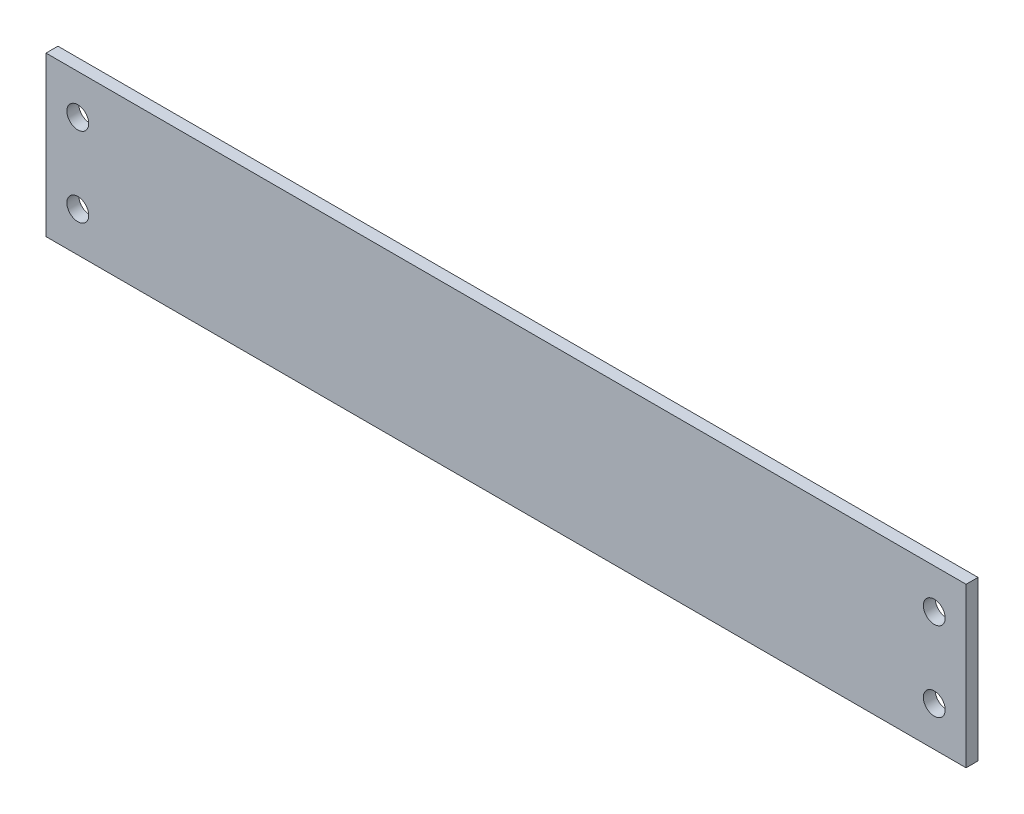
ISO-10303-21;
HEADER;
FILE_DESCRIPTION(('STEP AP214'),'2;1');
FILE_NAME('part.step','',(''),(''),'','','');
FILE_SCHEMA(('AUTOMOTIVE_DESIGN { 1 0 10303 214 1 1 1 1 }'));
ENDSEC;
DATA;
#1=APPLICATION_CONTEXT('core data for automotive mechanical design processes');
#2=APPLICATION_PROTOCOL_DEFINITION('international standard','automotive_design',2000,#1);
#3=PRODUCT_CONTEXT('',#1,'mechanical');
#4=PRODUCT('Part','Part','',(#3));
#5=PRODUCT_RELATED_PRODUCT_CATEGORY('part','',(#4));
#6=PRODUCT_DEFINITION_FORMATION('','',#4);
#7=PRODUCT_DEFINITION_CONTEXT('part definition',#1,'design');
#8=PRODUCT_DEFINITION('design','',#6,#7);
#9=PRODUCT_DEFINITION_SHAPE('','',#8);
#10=(LENGTH_UNIT() NAMED_UNIT(*) SI_UNIT(.MILLI.,.METRE.));
#11=(NAMED_UNIT(*) PLANE_ANGLE_UNIT() SI_UNIT($,.RADIAN.));
#12=(NAMED_UNIT(*) SI_UNIT($,.STERADIAN.) SOLID_ANGLE_UNIT());
#13=UNCERTAINTY_MEASURE_WITH_UNIT(LENGTH_MEASURE(1.E-05),#10,'distance_accuracy_value','');
#14=(GEOMETRIC_REPRESENTATION_CONTEXT(3) GLOBAL_UNCERTAINTY_ASSIGNED_CONTEXT((#13)) GLOBAL_UNIT_ASSIGNED_CONTEXT((#10,
#11,#12)) REPRESENTATION_CONTEXT('',''));
#15=CARTESIAN_POINT('',(0.,0.,0.));
#16=DIRECTION('',(0.,0.,1.));
#17=DIRECTION('',(1.,0.,0.));
#18=AXIS2_PLACEMENT_3D('',#15,#16,#17);
#19=CARTESIAN_POINT('',(-22.,36.75,-3.));
#20=DIRECTION('',(0.,1.,0.));
#21=DIRECTION('',(-1.,0.,0.));
#22=AXIS2_PLACEMENT_3D('',#19,#20,#21);
#23=PLANE('',#22);
#24=DIRECTION('',(-1.,0.,0.));
#25=VECTOR('',#24,1.);
#26=CARTESIAN_POINT('',(-22.,36.75,0.));
#27=LINE('',#26,#25);
#28=CARTESIAN_POINT('',(209.5,36.75,0.));
#29=VERTEX_POINT('',#28);
#30=CARTESIAN_POINT('',(-22.,36.75,0.));
#31=VERTEX_POINT('',#30);
#32=EDGE_CURVE('E104',#29,#31,#27,.T.);
#33=ORIENTED_EDGE('',*,*,#32,.F.);
#34=DIRECTION('',(0.,0.,1.));
#35=VECTOR('',#34,1.);
#36=CARTESIAN_POINT('',(209.5,36.75,-3.));
#37=LINE('',#36,#35);
#38=CARTESIAN_POINT('',(209.5,36.75,-3.));
#39=VERTEX_POINT('',#38);
#40=EDGE_CURVE('E11',#39,#29,#37,.T.);
#41=ORIENTED_EDGE('',*,*,#40,.F.);
#42=DIRECTION('',(-1.,0.,0.));
#43=VECTOR('',#42,1.);
#44=CARTESIAN_POINT('',(-22.,36.75,-3.));
#45=LINE('',#44,#43);
#46=CARTESIAN_POINT('',(-22.,36.75,-3.));
#47=VERTEX_POINT('',#46);
#48=EDGE_CURVE('E96',#39,#47,#45,.T.);
#49=ORIENTED_EDGE('',*,*,#48,.T.);
#50=DIRECTION('',(0.,0.,1.));
#51=VECTOR('',#50,1.);
#52=CARTESIAN_POINT('',(-22.,36.75,-3.));
#53=LINE('',#52,#51);
#54=EDGE_CURVE('E41',#47,#31,#53,.T.);
#55=ORIENTED_EDGE('',*,*,#54,.T.);
#56=EDGE_LOOP('',(#33,#41,#49,#55));
#57=FACE_BOUND('',#56,.T.);
#58=ADVANCED_FACE('F38',(#57),#23,.T.);
#59=CARTESIAN_POINT('',(209.5,36.75,-3.));
#60=DIRECTION('',(1.,0.,0.));
#61=DIRECTION('',(0.,0.,-1.));
#62=AXIS2_PLACEMENT_3D('',#59,#60,#61);
#63=PLANE('',#62);
#64=DIRECTION('',(0.,1.,0.));
#65=VECTOR('',#64,1.);
#66=CARTESIAN_POINT('',(209.5,36.75,0.));
#67=LINE('',#66,#65);
#68=CARTESIAN_POINT('',(209.5,-3.25,0.));
#69=VERTEX_POINT('',#68);
#70=EDGE_CURVE('E99',#69,#29,#67,.T.);
#71=ORIENTED_EDGE('',*,*,#70,.F.);
#72=DIRECTION('',(0.,0.,1.));
#73=VECTOR('',#72,1.);
#74=CARTESIAN_POINT('',(209.5,-3.25,-3.));
#75=LINE('',#74,#73);
#76=CARTESIAN_POINT('',(209.5,-3.25,-3.));
#77=VERTEX_POINT('',#76);
#78=EDGE_CURVE('E47',#77,#69,#75,.T.);
#79=ORIENTED_EDGE('',*,*,#78,.F.);
#80=DIRECTION('',(0.,1.,0.));
#81=VECTOR('',#80,1.);
#82=CARTESIAN_POINT('',(209.5,36.75,-3.));
#83=LINE('',#82,#81);
#84=EDGE_CURVE('E93',#77,#39,#83,.T.);
#85=ORIENTED_EDGE('',*,*,#84,.T.);
#86=ORIENTED_EDGE('',*,*,#40,.T.);
#87=EDGE_LOOP('',(#71,#79,#85,#86));
#88=FACE_BOUND('',#87,.T.);
#89=ADVANCED_FACE('F116',(#88),#63,.T.);
#90=CARTESIAN_POINT('',(-22.,-3.25,-3.));
#91=DIRECTION('',(0.,-1.,0.));
#92=DIRECTION('',(1.,0.,0.));
#93=AXIS2_PLACEMENT_3D('',#90,#91,#92);
#94=PLANE('',#93);
#95=DIRECTION('',(1.,0.,0.));
#96=VECTOR('',#95,1.);
#97=CARTESIAN_POINT('',(-22.,-3.25,0.));
#98=LINE('',#97,#96);
#99=CARTESIAN_POINT('',(-22.,-3.25,0.));
#100=VERTEX_POINT('',#99);
#101=EDGE_CURVE('E88',#100,#69,#98,.T.);
#102=ORIENTED_EDGE('',*,*,#101,.F.);
#103=DIRECTION('',(0.,0.,1.));
#104=VECTOR('',#103,1.);
#105=CARTESIAN_POINT('',(-22.,-3.25,-3.));
#106=LINE('',#105,#104);
#107=CARTESIAN_POINT('',(-22.,-3.25,-3.));
#108=VERTEX_POINT('',#107);
#109=EDGE_CURVE('E83',#108,#100,#106,.T.);
#110=ORIENTED_EDGE('',*,*,#109,.F.);
#111=DIRECTION('',(1.,0.,0.));
#112=VECTOR('',#111,1.);
#113=CARTESIAN_POINT('',(-22.,-3.25,-3.));
#114=LINE('',#113,#112);
#115=EDGE_CURVE('E86',#108,#77,#114,.T.);
#116=ORIENTED_EDGE('',*,*,#115,.T.);
#117=ORIENTED_EDGE('',*,*,#78,.T.);
#118=EDGE_LOOP('',(#102,#110,#116,#117));
#119=FACE_BOUND('',#118,.T.);
#120=ADVANCED_FACE('F85',(#119),#94,.T.);
#121=CARTESIAN_POINT('',(-22.,36.75,-3.));
#122=DIRECTION('',(-1.,0.,0.));
#123=DIRECTION('',(0.,0.,1.));
#124=AXIS2_PLACEMENT_3D('',#121,#122,#123);
#125=PLANE('',#124);
#126=DIRECTION('',(0.,-1.,0.));
#127=VECTOR('',#126,1.);
#128=CARTESIAN_POINT('',(-22.,36.75,0.));
#129=LINE('',#128,#127);
#130=EDGE_CURVE('E108',#31,#100,#129,.T.);
#131=ORIENTED_EDGE('',*,*,#130,.F.);
#132=ORIENTED_EDGE('',*,*,#54,.F.);
#133=DIRECTION('',(0.,-1.,0.));
#134=VECTOR('',#133,1.);
#135=CARTESIAN_POINT('',(-22.,36.75,-3.));
#136=LINE('',#135,#134);
#137=EDGE_CURVE('E92',#47,#108,#136,.T.);
#138=ORIENTED_EDGE('',*,*,#137,.T.);
#139=ORIENTED_EDGE('',*,*,#109,.T.);
#140=EDGE_LOOP('',(#131,#132,#138,#139));
#141=FACE_BOUND('',#140,.T.);
#142=ADVANCED_FACE('F95',(#141),#125,.T.);
#143=CARTESIAN_POINT('',(0.,0.,-3.));
#144=DIRECTION('',(0.,0.,-1.));
#145=DIRECTION('',(-1.,0.,0.));
#146=AXIS2_PLACEMENT_3D('',#143,#144,#145);
#147=PLANE('',#146);
#148=CARTESIAN_POINT('',(201.5,26.75,-3.));
#149=DIRECTION('',(0.,0.,-1.));
#150=DIRECTION('',(-1.,0.,0.));
#151=AXIS2_PLACEMENT_3D('',#148,#149,#150);
#152=CIRCLE('',#151,2.75);
#153=CARTESIAN_POINT('',(198.75,26.75,-3.));
#154=VERTEX_POINT('',#153);
#155=EDGE_CURVE('E160',#154,#154,#152,.T.);
#156=ORIENTED_EDGE('',*,*,#155,.F.);
#157=EDGE_LOOP('',(#156));
#158=FACE_BOUND('',#157,.T.);
#159=CARTESIAN_POINT('',(201.5,6.75,-3.));
#160=DIRECTION('',(0.,0.,-1.));
#161=DIRECTION('',(-1.,0.,0.));
#162=AXIS2_PLACEMENT_3D('',#159,#160,#161);
#163=CIRCLE('',#162,2.75);
#164=CARTESIAN_POINT('',(198.75,6.75,-3.));
#165=VERTEX_POINT('',#164);
#166=EDGE_CURVE('E162',#165,#165,#163,.T.);
#167=ORIENTED_EDGE('',*,*,#166,.F.);
#168=EDGE_LOOP('',(#167));
#169=FACE_BOUND('',#168,.T.);
#170=CARTESIAN_POINT('',(-14.,26.75,-3.));
#171=DIRECTION('',(0.,0.,-1.));
#172=DIRECTION('',(-1.,0.,0.));
#173=AXIS2_PLACEMENT_3D('',#170,#171,#172);
#174=CIRCLE('',#173,2.75);
#175=CARTESIAN_POINT('',(-16.75,26.75,-3.));
#176=VERTEX_POINT('',#175);
#177=EDGE_CURVE('E170',#176,#176,#174,.T.);
#178=ORIENTED_EDGE('',*,*,#177,.F.);
#179=EDGE_LOOP('',(#178));
#180=FACE_BOUND('',#179,.T.);
#181=CARTESIAN_POINT('',(-14.,6.75,-3.));
#182=DIRECTION('',(0.,0.,-1.));
#183=DIRECTION('',(-1.,0.,0.));
#184=AXIS2_PLACEMENT_3D('',#181,#182,#183);
#185=CIRCLE('',#184,2.75);
#186=CARTESIAN_POINT('',(-16.75,6.75,-3.));
#187=VERTEX_POINT('',#186);
#188=EDGE_CURVE('E176',#187,#187,#185,.T.);
#189=ORIENTED_EDGE('',*,*,#188,.F.);
#190=EDGE_LOOP('',(#189));
#191=FACE_BOUND('',#190,.T.);
#192=ORIENTED_EDGE('',*,*,#48,.F.);
#193=ORIENTED_EDGE('',*,*,#84,.F.);
#194=ORIENTED_EDGE('',*,*,#115,.F.);
#195=ORIENTED_EDGE('',*,*,#137,.F.);
#196=EDGE_LOOP('',(#192,#193,#194,#195));
#197=FACE_BOUND('',#196,.T.);
#198=ADVANCED_FACE('F91',(#158,#169,#180,#191,#197),#147,.T.);
#199=CARTESIAN_POINT('',(0.,0.,0.));
#200=DIRECTION('',(0.,0.,-1.));
#201=DIRECTION('',(-1.,0.,0.));
#202=AXIS2_PLACEMENT_3D('',#199,#200,#201);
#203=PLANE('',#202);
#204=CARTESIAN_POINT('',(201.5,26.75,0.));
#205=DIRECTION('',(0.,0.,-1.));
#206=DIRECTION('',(-1.,0.,0.));
#207=AXIS2_PLACEMENT_3D('',#204,#205,#206);
#208=CIRCLE('',#207,2.75);
#209=CARTESIAN_POINT('',(198.75,26.75,0.));
#210=VERTEX_POINT('',#209);
#211=EDGE_CURVE('E158',#210,#210,#208,.T.);
#212=ORIENTED_EDGE('',*,*,#211,.T.);
#213=EDGE_LOOP('',(#212));
#214=FACE_BOUND('',#213,.T.);
#215=CARTESIAN_POINT('',(201.5,6.75,0.));
#216=DIRECTION('',(0.,0.,-1.));
#217=DIRECTION('',(-1.,0.,0.));
#218=AXIS2_PLACEMENT_3D('',#215,#216,#217);
#219=CIRCLE('',#218,2.75);
#220=CARTESIAN_POINT('',(198.75,6.75,0.));
#221=VERTEX_POINT('',#220);
#222=EDGE_CURVE('E167',#221,#221,#219,.T.);
#223=ORIENTED_EDGE('',*,*,#222,.T.);
#224=EDGE_LOOP('',(#223));
#225=FACE_BOUND('',#224,.T.);
#226=CARTESIAN_POINT('',(-14.,26.75,0.));
#227=DIRECTION('',(0.,0.,-1.));
#228=DIRECTION('',(-1.,0.,0.));
#229=AXIS2_PLACEMENT_3D('',#226,#227,#228);
#230=CIRCLE('',#229,2.75);
#231=CARTESIAN_POINT('',(-16.75,26.75,0.));
#232=VERTEX_POINT('',#231);
#233=EDGE_CURVE('E173',#232,#232,#230,.T.);
#234=ORIENTED_EDGE('',*,*,#233,.T.);
#235=EDGE_LOOP('',(#234));
#236=FACE_BOUND('',#235,.T.);
#237=CARTESIAN_POINT('',(-14.,6.75,0.));
#238=DIRECTION('',(0.,0.,-1.));
#239=DIRECTION('',(-1.,0.,0.));
#240=AXIS2_PLACEMENT_3D('',#237,#238,#239);
#241=CIRCLE('',#240,2.75);
#242=CARTESIAN_POINT('',(-16.75,6.75,0.));
#243=VERTEX_POINT('',#242);
#244=EDGE_CURVE('E109',#243,#243,#241,.T.);
#245=ORIENTED_EDGE('',*,*,#244,.T.);
#246=EDGE_LOOP('',(#245));
#247=FACE_BOUND('',#246,.T.);
#248=ORIENTED_EDGE('',*,*,#32,.T.);
#249=ORIENTED_EDGE('',*,*,#130,.T.);
#250=ORIENTED_EDGE('',*,*,#101,.T.);
#251=ORIENTED_EDGE('',*,*,#70,.T.);
#252=EDGE_LOOP('',(#248,#249,#250,#251));
#253=FACE_BOUND('',#252,.T.);
#254=ADVANCED_FACE('F115',(#214,#225,#236,#247,#253),#203,.F.);
#255=CARTESIAN_POINT('',(-14.,6.75,-3.));
#256=DIRECTION('',(0.,0.,-1.));
#257=DIRECTION('',(-1.,0.,0.));
#258=AXIS2_PLACEMENT_3D('',#255,#256,#257);
#259=CYLINDRICAL_SURFACE('',#258,2.75);
#260=ORIENTED_EDGE('',*,*,#244,.F.);
#261=EDGE_LOOP('',(#260));
#262=FACE_BOUND('',#261,.T.);
#263=ORIENTED_EDGE('',*,*,#188,.T.);
#264=EDGE_LOOP('',(#263));
#265=FACE_BOUND('',#264,.T.);
#266=ADVANCED_FACE('F134',(#262,#265),#259,.F.);
#267=CARTESIAN_POINT('',(-14.,26.75,-3.));
#268=DIRECTION('',(0.,0.,-1.));
#269=DIRECTION('',(-1.,0.,0.));
#270=AXIS2_PLACEMENT_3D('',#267,#268,#269);
#271=CYLINDRICAL_SURFACE('',#270,2.75);
#272=ORIENTED_EDGE('',*,*,#233,.F.);
#273=EDGE_LOOP('',(#272));
#274=FACE_BOUND('',#273,.T.);
#275=ORIENTED_EDGE('',*,*,#177,.T.);
#276=EDGE_LOOP('',(#275));
#277=FACE_BOUND('',#276,.T.);
#278=ADVANCED_FACE('F141',(#274,#277),#271,.F.);
#279=CARTESIAN_POINT('',(201.5,6.75,-3.));
#280=DIRECTION('',(0.,0.,-1.));
#281=DIRECTION('',(-1.,0.,0.));
#282=AXIS2_PLACEMENT_3D('',#279,#280,#281);
#283=CYLINDRICAL_SURFACE('',#282,2.75);
#284=ORIENTED_EDGE('',*,*,#222,.F.);
#285=EDGE_LOOP('',(#284));
#286=FACE_BOUND('',#285,.T.);
#287=ORIENTED_EDGE('',*,*,#166,.T.);
#288=EDGE_LOOP('',(#287));
#289=FACE_BOUND('',#288,.T.);
#290=ADVANCED_FACE('F145',(#286,#289),#283,.F.);
#291=CARTESIAN_POINT('',(201.5,26.75,-3.));
#292=DIRECTION('',(0.,0.,-1.));
#293=DIRECTION('',(-1.,0.,0.));
#294=AXIS2_PLACEMENT_3D('',#291,#292,#293);
#295=CYLINDRICAL_SURFACE('',#294,2.75);
#296=ORIENTED_EDGE('',*,*,#211,.F.);
#297=EDGE_LOOP('',(#296));
#298=FACE_BOUND('',#297,.T.);
#299=ORIENTED_EDGE('',*,*,#155,.T.);
#300=EDGE_LOOP('',(#299));
#301=FACE_BOUND('',#300,.T.);
#302=ADVANCED_FACE('F149',(#298,#301),#295,.F.);
#303=CLOSED_SHELL('',(#58,#89,#120,#142,#198,#254,#266,#278,#290,#302));
#304=MANIFOLD_SOLID_BREP('B2',#303);
#305=ADVANCED_BREP_SHAPE_REPRESENTATION('',(#18,#304),#14);
#306=SHAPE_DEFINITION_REPRESENTATION(#9,#305);
ENDSEC;
END-ISO-10303-21;
